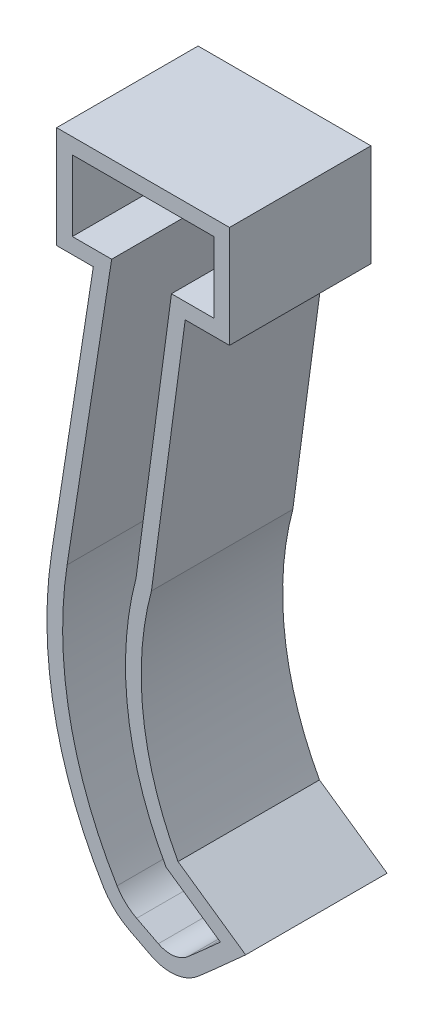
ISO-10303-21;
HEADER;
FILE_DESCRIPTION(('STEP AP214'),'2;1');
FILE_NAME('part.step','',(''),(''),'','','');
FILE_SCHEMA(('AUTOMOTIVE_DESIGN { 1 0 10303 214 1 1 1 1 }'));
ENDSEC;
DATA;
#1=APPLICATION_CONTEXT('core data for automotive mechanical design processes');
#2=APPLICATION_PROTOCOL_DEFINITION('international standard','automotive_design',2000,#1);
#3=PRODUCT_CONTEXT('',#1,'mechanical');
#4=PRODUCT('Part','Part','',(#3));
#5=PRODUCT_RELATED_PRODUCT_CATEGORY('part','',(#4));
#6=PRODUCT_DEFINITION_FORMATION('','',#4);
#7=PRODUCT_DEFINITION_CONTEXT('part definition',#1,'design');
#8=PRODUCT_DEFINITION('design','',#6,#7);
#9=PRODUCT_DEFINITION_SHAPE('','',#8);
#10=(LENGTH_UNIT() NAMED_UNIT(*) SI_UNIT(.MILLI.,.METRE.));
#11=(NAMED_UNIT(*) PLANE_ANGLE_UNIT() SI_UNIT($,.RADIAN.));
#12=(NAMED_UNIT(*) SI_UNIT($,.STERADIAN.) SOLID_ANGLE_UNIT());
#13=UNCERTAINTY_MEASURE_WITH_UNIT(LENGTH_MEASURE(1.E-05),#10,'distance_accuracy_value','');
#14=(GEOMETRIC_REPRESENTATION_CONTEXT(3) GLOBAL_UNCERTAINTY_ASSIGNED_CONTEXT((#13)) GLOBAL_UNIT_ASSIGNED_CONTEXT((#10,
#11,#12)) REPRESENTATION_CONTEXT('',''));
#15=CARTESIAN_POINT('',(0.,0.,0.));
#16=DIRECTION('',(0.,0.,1.));
#17=DIRECTION('',(1.,0.,0.));
#18=AXIS2_PLACEMENT_3D('',#15,#16,#17);
#19=CARTESIAN_POINT('',(0.,0.,16.));
#20=DIRECTION('',(0.,0.,1.));
#21=DIRECTION('',(1.,0.,0.));
#22=AXIS2_PLACEMENT_3D('',#19,#20,#21);
#23=PLANE('',#22);
#24=DIRECTION('',(0.,-1.,0.));
#25=VECTOR('',#24,1.);
#26=CARTESIAN_POINT('',(-48.7629088317488,41.8874487226326,16.));
#27=LINE('',#26,#25);
#28=CARTESIAN_POINT('',(-48.7629088317488,54.8874487226326,16.));
#29=VERTEX_POINT('',#28);
#30=CARTESIAN_POINT('',(-48.7629088317488,41.8874487226326,16.));
#31=VERTEX_POINT('',#30);
#32=EDGE_CURVE('E399',#29,#31,#27,.T.);
#33=ORIENTED_EDGE('',*,*,#32,.T.);
#34=DIRECTION('',(1.,0.,0.));
#35=VECTOR('',#34,1.);
#36=CARTESIAN_POINT('',(-44.0972783306751,41.8874487226326,16.));
#37=LINE('',#36,#35);
#38=CARTESIAN_POINT('',(-44.0972783306751,41.8874487226326,16.));
#39=VERTEX_POINT('',#38);
#40=EDGE_CURVE('E401',#31,#39,#37,.T.);
#41=ORIENTED_EDGE('',*,*,#40,.T.);
#42=DIRECTION('',(-0.153374734440995,-0.988168098470677,0.));
#43=VECTOR('',#42,1.);
#44=CARTESIAN_POINT('',(-49.4084049235339,7.66873672204978,16.));
#45=LINE('',#44,#43);
#46=CARTESIAN_POINT('',(-49.4084049235339,7.66873672204978,16.));
#47=VERTEX_POINT('',#46);
#48=EDGE_CURVE('E403',#39,#47,#45,.T.);
#49=ORIENTED_EDGE('',*,*,#48,.T.);
#50=CARTESIAN_POINT('',(0.,0.,16.));
#51=DIRECTION('',(0.,0.,1.));
#52=DIRECTION('',(1.,0.,0.));
#53=AXIS2_PLACEMENT_3D('',#50,#51,#52);
#54=CIRCLE('',#53,50.);
#55=CARTESIAN_POINT('',(-42.789032240421,-25.8669426088244,16.));
#56=VERTEX_POINT('',#55);
#57=EDGE_CURVE('E405',#47,#56,#54,.T.);
#58=ORIENTED_EDGE('',*,*,#57,.T.);
#59=CARTESIAN_POINT('',(-35.7012837669037,-21.5822375479546,16.));
#60=DIRECTION('',(0.,0.,1.));
#61=DIRECTION('',(1.,0.,0.));
#62=AXIS2_PLACEMENT_3D('',#59,#60,#61);
#63=CIRCLE('',#62,8.28220235701161);
#64=CARTESIAN_POINT('',(-39.4968156383013,-28.9435427104713,16.));
#65=VERTEX_POINT('',#64);
#66=EDGE_CURVE('E407',#56,#65,#63,.T.);
#67=ORIENTED_EDGE('',*,*,#66,.T.);
#68=DIRECTION('',(0.888810106925808,-0.458275674487021,0.));
#69=VECTOR('',#68,1.);
#70=CARTESIAN_POINT('',(-39.4968156383013,-28.9435427104713,16.));
#71=LINE('',#70,#69);
#72=CARTESIAN_POINT('',(-36.736058642487,-30.3670051176749,16.));
#73=VERTEX_POINT('',#72);
#74=EDGE_CURVE('E409',#65,#73,#71,.T.);
#75=ORIENTED_EDGE('',*,*,#74,.T.);
#76=CARTESIAN_POINT('',(-34.2757834827216,-25.5953850000115,16.));
#77=DIRECTION('',(0.,0.,1.));
#78=DIRECTION('',(1.,0.,0.));
#79=AXIS2_PLACEMENT_3D('',#76,#77,#78);
#80=CIRCLE('',#79,5.36854844525492);
#81=CARTESIAN_POINT('',(-30.7348627046786,-29.6306287909952,16.));
#82=VERTEX_POINT('',#81);
#83=EDGE_CURVE('E411',#73,#82,#80,.T.);
#84=ORIENTED_EDGE('',*,*,#83,.T.);
#85=DIRECTION('',(0.751645222564825,0.659567630645619,0.));
#86=VECTOR('',#85,1.);
#87=CARTESIAN_POINT('',(-28.7384354982377,-27.8787667119476,16.));
#88=LINE('',#87,#86);
#89=CARTESIAN_POINT('',(-28.7384354982377,-27.8787667119476,16.));
#90=VERTEX_POINT('',#89);
#91=EDGE_CURVE('E413',#82,#90,#88,.T.);
#92=ORIENTED_EDGE('',*,*,#91,.T.);
#93=DIRECTION('',(0.744371336366947,0.667765912274118,0.));
#94=VECTOR('',#93,1.);
#95=CARTESIAN_POINT('',(-28.7384354982377,-27.8787667119476,16.));
#96=LINE('',#95,#94);
#97=CARTESIAN_POINT('',(-24.7087669028506,-24.2638030583303,16.));
#98=VERTEX_POINT('',#97);
#99=EDGE_CURVE('E415',#90,#98,#96,.T.);
#100=ORIENTED_EDGE('',*,*,#99,.T.);
#101=DIRECTION('',(-0.821144887277735,0.570719785969995,0.));
#102=VECTOR('',#101,1.);
#103=CARTESIAN_POINT('',(-24.7087669028506,-24.2638030583303,16.));
#104=LINE('',#103,#102);
#105=CARTESIAN_POINT('',(-33.3118761230276,-18.2843897673416,16.));
#106=VERTEX_POINT('',#105);
#107=EDGE_CURVE('E417',#98,#106,#104,.T.);
#108=ORIENTED_EDGE('',*,*,#107,.T.);
#109=CARTESIAN_POINT('',(0.,0.,16.));
#110=DIRECTION('',(0.,0.,-1.));
#111=DIRECTION('',(1.,0.,0.));
#112=AXIS2_PLACEMENT_3D('',#109,#110,#111);
#113=CIRCLE('',#112,38.);
#114=CARTESIAN_POINT('',(-36.6998555679504,9.85497850284718,16.));
#115=VERTEX_POINT('',#114);
#116=EDGE_CURVE('E238',#106,#115,#113,.T.);
#117=ORIENTED_EDGE('',*,*,#116,.T.);
#118=DIRECTION('',(0.132966551067672,0.991120525615915,0.));
#119=VECTOR('',#118,1.);
#120=CARTESIAN_POINT('',(-32.402449776,41.8874487226326,16.));
#121=LINE('',#120,#119);
#122=CARTESIAN_POINT('',(-32.402449776,41.8874487226326,16.));
#123=VERTEX_POINT('',#122);
#124=EDGE_CURVE('E420',#115,#123,#121,.T.);
#125=ORIENTED_EDGE('',*,*,#124,.T.);
#126=DIRECTION('',(1.,0.,0.));
#127=VECTOR('',#126,1.);
#128=CARTESIAN_POINT('',(-26.7629088317488,41.8874487226326,16.));
#129=LINE('',#128,#127);
#130=CARTESIAN_POINT('',(-26.7629088317488,41.8874487226326,16.));
#131=VERTEX_POINT('',#130);
#132=EDGE_CURVE('E422',#123,#131,#129,.T.);
#133=ORIENTED_EDGE('',*,*,#132,.T.);
#134=DIRECTION('',(0.,1.,0.));
#135=VECTOR('',#134,1.);
#136=CARTESIAN_POINT('',(-26.7629088317488,54.8874487226326,16.));
#137=LINE('',#136,#135);
#138=CARTESIAN_POINT('',(-26.7629088317488,54.8874487226326,16.));
#139=VERTEX_POINT('',#138);
#140=EDGE_CURVE('E424',#131,#139,#137,.T.);
#141=ORIENTED_EDGE('',*,*,#140,.T.);
#142=DIRECTION('',(-1.,0.,0.));
#143=VECTOR('',#142,1.);
#144=CARTESIAN_POINT('',(-48.7629088317488,54.8874487226326,16.));
#145=LINE('',#144,#143);
#146=EDGE_CURVE('E57',#139,#29,#145,.T.);
#147=ORIENTED_EDGE('',*,*,#146,.T.);
#148=EDGE_LOOP('',(#33,#41,#49,#58,#67,#75,#84,#92,#100,#108,#117,#125,#133,#141,#147));
#149=FACE_BOUND('',#148,.T.);
#150=CARTESIAN_POINT('',(-35.7012837669037,-21.5822375479546,16.));
#151=DIRECTION('',(0.,0.,1.));
#152=DIRECTION('',(1.,0.,0.));
#153=AXIS2_PLACEMENT_3D('',#150,#151,#152);
#154=CIRCLE('',#153,6.28220235701162);
#155=CARTESIAN_POINT('',(-41.0774709508041,-24.8322649044715,16.));
#156=VERTEX_POINT('',#155);
#157=CARTESIAN_POINT('',(-38.5802642893273,-27.1659224966197,16.));
#158=VERTEX_POINT('',#157);
#159=EDGE_CURVE('E297',#156,#158,#154,.T.);
#160=ORIENTED_EDGE('',*,*,#159,.F.);
#161=CARTESIAN_POINT('',(0.,0.,16.));
#162=DIRECTION('',(0.,0.,1.));
#163=DIRECTION('',(1.,0.,0.));
#164=AXIS2_PLACEMENT_3D('',#161,#162,#163);
#165=CIRCLE('',#164,48.);
#166=CARTESIAN_POINT('',(-47.4320687265925,7.36198725316778,16.));
#167=VERTEX_POINT('',#166);
#168=EDGE_CURVE('E295',#167,#156,#165,.T.);
#169=ORIENTED_EDGE('',*,*,#168,.F.);
#170=DIRECTION('',(-0.153374734440995,-0.988168098470677,0.));
#171=VECTOR('',#170,1.);
#172=CARTESIAN_POINT('',(-47.4320687265925,7.36198725316778,16.));
#173=LINE('',#172,#171);
#174=CARTESIAN_POINT('',(-41.7629088317488,43.8874487226326,16.));
#175=VERTEX_POINT('',#174);
#176=EDGE_CURVE('E324',#175,#167,#173,.T.);
#177=ORIENTED_EDGE('',*,*,#176,.F.);
#178=DIRECTION('',(1.,0.,0.));
#179=VECTOR('',#178,1.);
#180=CARTESIAN_POINT('',(-41.7629088317488,43.8874487226326,16.));
#181=LINE('',#180,#179);
#182=CARTESIAN_POINT('',(-46.7629088317488,43.8874487226326,16.));
#183=VERTEX_POINT('',#182);
#184=EDGE_CURVE('E322',#183,#175,#181,.T.);
#185=ORIENTED_EDGE('',*,*,#184,.F.);
#186=DIRECTION('',(0.,-1.,0.));
#187=VECTOR('',#186,1.);
#188=CARTESIAN_POINT('',(-46.7629088317488,43.8874487226326,16.));
#189=LINE('',#188,#187);
#190=CARTESIAN_POINT('',(-46.7629088317488,52.8874487226326,16.));
#191=VERTEX_POINT('',#190);
#192=EDGE_CURVE('E320',#191,#183,#189,.T.);
#193=ORIENTED_EDGE('',*,*,#192,.F.);
#194=DIRECTION('',(-1.,0.,0.));
#195=VECTOR('',#194,1.);
#196=CARTESIAN_POINT('',(-46.7629088317488,52.8874487226326,16.));
#197=LINE('',#196,#195);
#198=CARTESIAN_POINT('',(-28.7629088317488,52.8874487226326,16.));
#199=VERTEX_POINT('',#198);
#200=EDGE_CURVE('E318',#199,#191,#197,.T.);
#201=ORIENTED_EDGE('',*,*,#200,.F.);
#202=DIRECTION('',(0.,1.,0.));
#203=VECTOR('',#202,1.);
#204=CARTESIAN_POINT('',(-28.7629088317488,52.8874487226326,16.));
#205=LINE('',#204,#203);
#206=CARTESIAN_POINT('',(-28.7629088317488,43.8874487226326,16.));
#207=VERTEX_POINT('',#206);
#208=EDGE_CURVE('E316',#207,#199,#205,.T.);
#209=ORIENTED_EDGE('',*,*,#208,.F.);
#210=DIRECTION('',(1.,0.,0.));
#211=VECTOR('',#210,1.);
#212=CARTESIAN_POINT('',(-28.7629088317488,43.8874487226326,16.));
#213=LINE('',#212,#211);
#214=CARTESIAN_POINT('',(-34.1520522239838,43.8874487226326,16.));
#215=VERTEX_POINT('',#214);
#216=EDGE_CURVE('E314',#215,#207,#213,.T.);
#217=ORIENTED_EDGE('',*,*,#216,.F.);
#218=DIRECTION('',(0.132966551067672,0.991120525615915,0.));
#219=VECTOR('',#218,1.);
#220=CARTESIAN_POINT('',(-34.1520522239838,43.8874487226326,16.));
#221=LINE('',#220,#219);
#222=CARTESIAN_POINT('',(-38.6651440398091,10.247274583069,16.));
#223=VERTEX_POINT('',#222);
#224=EDGE_CURVE('E312',#223,#215,#221,.T.);
#225=ORIENTED_EDGE('',*,*,#224,.F.);
#226=CARTESIAN_POINT('',(0.,0.,16.));
#227=DIRECTION('',(0.,0.,-1.));
#228=DIRECTION('',(1.,0.,0.));
#229=AXIS2_PLACEMENT_3D('',#226,#227,#228);
#230=CIRCLE('',#229,40.);
#231=CARTESIAN_POINT('',(-34.8338713027844,-19.6621822303898,16.));
#232=VERTEX_POINT('',#231);
#233=EDGE_CURVE('E310',#232,#223,#230,.T.);
#234=ORIENTED_EDGE('',*,*,#233,.F.);
#235=DIRECTION('',(-0.821144887277735,0.570719785969995,0.));
#236=VECTOR('',#235,1.);
#237=CARTESIAN_POINT('',(-27.9261539723172,-24.4632484215893,16.));
#238=LINE('',#237,#236);
#239=CARTESIAN_POINT('',(-27.9261539723172,-24.4632484215893,16.));
#240=VERTEX_POINT('',#239);
#241=EDGE_CURVE('E308',#240,#232,#238,.T.);
#242=ORIENTED_EDGE('',*,*,#241,.F.);
#243=DIRECTION('',(0.744371336366947,0.667765912274118,0.));
#244=VECTOR('',#243,1.);
#245=CARTESIAN_POINT('',(-30.065808902593,-26.3827052258248,16.));
#246=LINE('',#245,#244);
#247=CARTESIAN_POINT('',(-30.065808902593,-26.3827052258248,16.));
#248=VERTEX_POINT('',#247);
#249=EDGE_CURVE('E306',#248,#240,#246,.T.);
#250=ORIENTED_EDGE('',*,*,#249,.F.);
#251=DIRECTION('',(0.751645222564825,0.659567630645619,0.));
#252=VECTOR('',#251,1.);
#253=CARTESIAN_POINT('',(-30.065808902593,-26.3827052258248,16.));
#254=LINE('',#253,#252);
#255=CARTESIAN_POINT('',(-32.0539979659698,-28.1273383458655,16.));
#256=VERTEX_POINT('',#255);
#257=EDGE_CURVE('E304',#256,#248,#254,.T.);
#258=ORIENTED_EDGE('',*,*,#257,.F.);
#259=CARTESIAN_POINT('',(-34.2757834827216,-25.5953850000115,16.));
#260=DIRECTION('',(0.,0.,1.));
#261=DIRECTION('',(1.,0.,0.));
#262=AXIS2_PLACEMENT_3D('',#259,#260,#261);
#263=CIRCLE('',#262,3.36854844525494);
#264=CARTESIAN_POINT('',(-35.819507293513,-28.5893849038233,16.));
#265=VERTEX_POINT('',#264);
#266=EDGE_CURVE('E302',#265,#256,#263,.T.);
#267=ORIENTED_EDGE('',*,*,#266,.F.);
#268=DIRECTION('',(0.888810106925802,-0.458275674487033,0.));
#269=VECTOR('',#268,1.);
#270=CARTESIAN_POINT('',(-38.5802642893273,-27.1659224966197,16.));
#271=LINE('',#270,#269);
#272=EDGE_CURVE('E300',#158,#265,#271,.T.);
#273=ORIENTED_EDGE('',*,*,#272,.F.);
#274=EDGE_LOOP('',(#160,#169,#177,#185,#193,#201,#209,#217,#225,#234,#242,#250,#258,#267,#273));
#275=FACE_BOUND('',#274,.T.);
#276=ADVANCED_FACE('F34',(#149,#275),#23,.T.);
#277=CARTESIAN_POINT('',(-48.7629088317488,41.8874487226326,16.));
#278=DIRECTION('',(1.,0.,0.));
#279=DIRECTION('',(0.,0.,-1.));
#280=AXIS2_PLACEMENT_3D('',#277,#278,#279);
#281=PLANE('',#280);
#282=DIRECTION('',(0.,0.,-1.));
#283=VECTOR('',#282,1.);
#284=CARTESIAN_POINT('',(-48.7629088317488,54.8874487226326,16.));
#285=LINE('',#284,#283);
#286=CARTESIAN_POINT('',(-48.7629088317488,54.8874487226326,-2.));
#287=VERTEX_POINT('',#286);
#288=EDGE_CURVE('E427',#29,#287,#285,.T.);
#289=ORIENTED_EDGE('',*,*,#288,.T.);
#290=DIRECTION('',(0.,1.,0.));
#291=VECTOR('',#290,1.);
#292=CARTESIAN_POINT('',(-48.7629088317488,54.8874487226326,-2.));
#293=LINE('',#292,#291);
#294=CARTESIAN_POINT('',(-48.7629088317488,41.8874487226326,-2.));
#295=VERTEX_POINT('',#294);
#296=EDGE_CURVE('E282',#295,#287,#293,.T.);
#297=ORIENTED_EDGE('',*,*,#296,.F.);
#298=DIRECTION('',(0.,0.,-1.));
#299=VECTOR('',#298,1.);
#300=CARTESIAN_POINT('',(-48.7629088317488,41.8874487226326,16.));
#301=LINE('',#300,#299);
#302=EDGE_CURVE('E11',#31,#295,#301,.T.);
#303=ORIENTED_EDGE('',*,*,#302,.F.);
#304=ORIENTED_EDGE('',*,*,#32,.F.);
#305=EDGE_LOOP('',(#289,#297,#303,#304));
#306=FACE_BOUND('',#305,.T.);
#307=ADVANCED_FACE('F36',(#306),#281,.F.);
#308=CARTESIAN_POINT('',(-44.0972783306751,41.8874487226326,16.));
#309=DIRECTION('',(0.,1.,0.));
#310=DIRECTION('',(0.,0.,1.));
#311=AXIS2_PLACEMENT_3D('',#308,#309,#310);
#312=PLANE('',#311);
#313=ORIENTED_EDGE('',*,*,#302,.T.);
#314=DIRECTION('',(-1.,0.,0.));
#315=VECTOR('',#314,1.);
#316=CARTESIAN_POINT('',(-48.7629088317488,41.8874487226326,-2.));
#317=LINE('',#316,#315);
#318=CARTESIAN_POINT('',(-44.0972783306751,41.8874487226326,-2.));
#319=VERTEX_POINT('',#318);
#320=EDGE_CURVE('E279',#319,#295,#317,.T.);
#321=ORIENTED_EDGE('',*,*,#320,.F.);
#322=DIRECTION('',(0.,0.,-1.));
#323=VECTOR('',#322,1.);
#324=CARTESIAN_POINT('',(-44.0972783306751,41.8874487226326,16.));
#325=LINE('',#324,#323);
#326=EDGE_CURVE('E42',#39,#319,#325,.T.);
#327=ORIENTED_EDGE('',*,*,#326,.F.);
#328=ORIENTED_EDGE('',*,*,#40,.F.);
#329=EDGE_LOOP('',(#313,#321,#327,#328));
#330=FACE_BOUND('',#329,.T.);
#331=ADVANCED_FACE('F458',(#330),#312,.F.);
#332=CARTESIAN_POINT('',(-49.4084049235339,7.66873672204978,16.));
#333=DIRECTION('',(0.988168098470677,-0.153374734440995,0.));
#334=DIRECTION('',(0.153374734440995,0.988168098470677,0.));
#335=AXIS2_PLACEMENT_3D('',#332,#333,#334);
#336=PLANE('',#335);
#337=ORIENTED_EDGE('',*,*,#326,.T.);
#338=DIRECTION('',(0.153374734440995,0.988168098470677,0.));
#339=VECTOR('',#338,1.);
#340=CARTESIAN_POINT('',(-44.0972783306751,41.8874487226326,-2.));
#341=LINE('',#340,#339);
#342=CARTESIAN_POINT('',(-49.4084049235339,7.66873672204979,-2.));
#343=VERTEX_POINT('',#342);
#344=EDGE_CURVE('E276',#343,#319,#341,.T.);
#345=ORIENTED_EDGE('',*,*,#344,.F.);
#346=DIRECTION('',(0.,0.,-1.));
#347=VECTOR('',#346,1.);
#348=CARTESIAN_POINT('',(-49.4084049235339,7.66873672204978,16.));
#349=LINE('',#348,#347);
#350=EDGE_CURVE('E447',#47,#343,#349,.T.);
#351=ORIENTED_EDGE('',*,*,#350,.F.);
#352=ORIENTED_EDGE('',*,*,#48,.F.);
#353=EDGE_LOOP('',(#337,#345,#351,#352));
#354=FACE_BOUND('',#353,.T.);
#355=ADVANCED_FACE('F452',(#354),#336,.F.);
#356=CARTESIAN_POINT('',(0.,0.,16.));
#357=DIRECTION('',(0.,0.,-1.));
#358=DIRECTION('',(-1.,0.,0.));
#359=AXIS2_PLACEMENT_3D('',#356,#357,#358);
#360=CYLINDRICAL_SURFACE('',#359,50.);
#361=ORIENTED_EDGE('',*,*,#350,.T.);
#362=CARTESIAN_POINT('',(0.,0.,-2.));
#363=DIRECTION('',(0.,0.,-1.));
#364=DIRECTION('',(-1.,0.,0.));
#365=AXIS2_PLACEMENT_3D('',#362,#363,#364);
#366=CIRCLE('',#365,50.);
#367=CARTESIAN_POINT('',(-42.789032240421,-25.8669426088244,-2.));
#368=VERTEX_POINT('',#367);
#369=EDGE_CURVE('E273',#368,#343,#366,.T.);
#370=ORIENTED_EDGE('',*,*,#369,.F.);
#371=DIRECTION('',(0.,0.,-1.));
#372=VECTOR('',#371,1.);
#373=CARTESIAN_POINT('',(-42.789032240421,-25.8669426088244,16.));
#374=LINE('',#373,#372);
#375=EDGE_CURVE('E445',#56,#368,#374,.T.);
#376=ORIENTED_EDGE('',*,*,#375,.F.);
#377=ORIENTED_EDGE('',*,*,#57,.F.);
#378=EDGE_LOOP('',(#361,#370,#376,#377));
#379=FACE_BOUND('',#378,.T.);
#380=ADVANCED_FACE('F505',(#379),#360,.T.);
#381=CARTESIAN_POINT('',(-35.7012837669037,-21.5822375479546,16.));
#382=DIRECTION('',(0.,0.,-1.));
#383=DIRECTION('',(-1.,0.,0.));
#384=AXIS2_PLACEMENT_3D('',#381,#382,#383);
#385=CYLINDRICAL_SURFACE('',#384,8.28220235701161);
#386=ORIENTED_EDGE('',*,*,#375,.T.);
#387=CARTESIAN_POINT('',(-35.7012837669037,-21.5822375479546,-2.));
#388=DIRECTION('',(0.,0.,-1.));
#389=DIRECTION('',(-1.,0.,0.));
#390=AXIS2_PLACEMENT_3D('',#387,#388,#389);
#391=CIRCLE('',#390,8.28220235701161);
#392=CARTESIAN_POINT('',(-39.4968156383013,-28.9435427104713,-2.));
#393=VERTEX_POINT('',#392);
#394=EDGE_CURVE('E270',#393,#368,#391,.T.);
#395=ORIENTED_EDGE('',*,*,#394,.F.);
#396=DIRECTION('',(0.,0.,-1.));
#397=VECTOR('',#396,1.);
#398=CARTESIAN_POINT('',(-39.4968156383013,-28.9435427104713,16.));
#399=LINE('',#398,#397);
#400=EDGE_CURVE('E443',#65,#393,#399,.T.);
#401=ORIENTED_EDGE('',*,*,#400,.F.);
#402=ORIENTED_EDGE('',*,*,#66,.F.);
#403=EDGE_LOOP('',(#386,#395,#401,#402));
#404=FACE_BOUND('',#403,.T.);
#405=ADVANCED_FACE('F502',(#404),#385,.T.);
#406=CARTESIAN_POINT('',(-39.4968156383013,-28.9435427104713,16.));
#407=DIRECTION('',(0.458275674487021,0.888810106925808,0.));
#408=DIRECTION('',(-0.888810106925808,0.458275674487021,0.));
#409=AXIS2_PLACEMENT_3D('',#406,#407,#408);
#410=PLANE('',#409);
#411=ORIENTED_EDGE('',*,*,#400,.T.);
#412=DIRECTION('',(-0.888810106925811,0.458275674487015,0.));
#413=VECTOR('',#412,1.);
#414=CARTESIAN_POINT('',(-39.4968156383013,-28.9435427104713,-2.));
#415=LINE('',#414,#413);
#416=CARTESIAN_POINT('',(-36.736058642487,-30.3670051176749,-2.));
#417=VERTEX_POINT('',#416);
#418=EDGE_CURVE('E267',#417,#393,#415,.T.);
#419=ORIENTED_EDGE('',*,*,#418,.F.);
#420=DIRECTION('',(0.,0.,-1.));
#421=VECTOR('',#420,1.);
#422=CARTESIAN_POINT('',(-36.736058642487,-30.3670051176749,16.));
#423=LINE('',#422,#421);
#424=EDGE_CURVE('E441',#73,#417,#423,.T.);
#425=ORIENTED_EDGE('',*,*,#424,.F.);
#426=ORIENTED_EDGE('',*,*,#74,.F.);
#427=EDGE_LOOP('',(#411,#419,#425,#426));
#428=FACE_BOUND('',#427,.T.);
#429=ADVANCED_FACE('F497',(#428),#410,.F.);
#430=CARTESIAN_POINT('',(-34.2757834827216,-25.5953850000115,16.));
#431=DIRECTION('',(0.,0.,-1.));
#432=DIRECTION('',(-1.,0.,0.));
#433=AXIS2_PLACEMENT_3D('',#430,#431,#432);
#434=CYLINDRICAL_SURFACE('',#433,5.36854844525492);
#435=ORIENTED_EDGE('',*,*,#424,.T.);
#436=CARTESIAN_POINT('',(-34.2757834827216,-25.5953850000115,-2.));
#437=DIRECTION('',(0.,0.,-1.));
#438=DIRECTION('',(-1.,0.,0.));
#439=AXIS2_PLACEMENT_3D('',#436,#437,#438);
#440=CIRCLE('',#439,5.36854844525491);
#441=CARTESIAN_POINT('',(-30.7348627046786,-29.6306287909952,-2.));
#442=VERTEX_POINT('',#441);
#443=EDGE_CURVE('E264',#442,#417,#440,.T.);
#444=ORIENTED_EDGE('',*,*,#443,.F.);
#445=DIRECTION('',(0.,0.,-1.));
#446=VECTOR('',#445,1.);
#447=CARTESIAN_POINT('',(-30.7348627046786,-29.6306287909952,16.));
#448=LINE('',#447,#446);
#449=EDGE_CURVE('E439',#82,#442,#448,.T.);
#450=ORIENTED_EDGE('',*,*,#449,.F.);
#451=ORIENTED_EDGE('',*,*,#83,.F.);
#452=EDGE_LOOP('',(#435,#444,#450,#451));
#453=FACE_BOUND('',#452,.T.);
#454=ADVANCED_FACE('F492',(#453),#434,.T.);
#455=CARTESIAN_POINT('',(-28.7384354982377,-27.8787667119476,16.));
#456=DIRECTION('',(-0.659567630645619,0.751645222564825,0.));
#457=DIRECTION('',(-0.751645222564825,-0.659567630645619,0.));
#458=AXIS2_PLACEMENT_3D('',#455,#456,#457);
#459=PLANE('',#458);
#460=ORIENTED_EDGE('',*,*,#449,.T.);
#461=DIRECTION('',(-0.751645222564825,-0.659567630645619,0.));
#462=VECTOR('',#461,1.);
#463=CARTESIAN_POINT('',(-30.7348627046786,-29.6306287909952,-2.));
#464=LINE('',#463,#462);
#465=CARTESIAN_POINT('',(-28.7384354982377,-27.8787667119476,-2.));
#466=VERTEX_POINT('',#465);
#467=EDGE_CURVE('E261',#466,#442,#464,.T.);
#468=ORIENTED_EDGE('',*,*,#467,.F.);
#469=DIRECTION('',(0.,0.,-1.));
#470=VECTOR('',#469,1.);
#471=CARTESIAN_POINT('',(-28.7384354982377,-27.8787667119476,16.));
#472=LINE('',#471,#470);
#473=EDGE_CURVE('E437',#90,#466,#472,.T.);
#474=ORIENTED_EDGE('',*,*,#473,.F.);
#475=ORIENTED_EDGE('',*,*,#91,.F.);
#476=EDGE_LOOP('',(#460,#468,#474,#475));
#477=FACE_BOUND('',#476,.T.);
#478=ADVANCED_FACE('F488',(#477),#459,.F.);
#479=CARTESIAN_POINT('',(-28.7384354982377,-27.8787667119476,16.));
#480=DIRECTION('',(-0.667765912274119,0.744371336366947,0.));
#481=DIRECTION('',(-0.744371336366947,-0.667765912274119,0.));
#482=AXIS2_PLACEMENT_3D('',#479,#480,#481);
#483=PLANE('',#482);
#484=ORIENTED_EDGE('',*,*,#473,.T.);
#485=DIRECTION('',(-0.744371336366947,-0.667765912274118,0.));
#486=VECTOR('',#485,1.);
#487=CARTESIAN_POINT('',(-28.7384354982377,-27.8787667119476,-2.));
#488=LINE('',#487,#486);
#489=CARTESIAN_POINT('',(-24.7087669028506,-24.2638030583303,-2.));
#490=VERTEX_POINT('',#489);
#491=EDGE_CURVE('E251',#490,#466,#488,.T.);
#492=ORIENTED_EDGE('',*,*,#491,.F.);
#493=DIRECTION('',(0.,0.,-1.));
#494=VECTOR('',#493,1.);
#495=CARTESIAN_POINT('',(-24.7087669028506,-24.2638030583303,16.));
#496=LINE('',#495,#494);
#497=EDGE_CURVE('E241',#98,#490,#496,.T.);
#498=ORIENTED_EDGE('',*,*,#497,.F.);
#499=ORIENTED_EDGE('',*,*,#99,.F.);
#500=EDGE_LOOP('',(#484,#492,#498,#499));
#501=FACE_BOUND('',#500,.T.);
#502=ADVANCED_FACE('F484',(#501),#483,.F.);
#503=CARTESIAN_POINT('',(-24.7087669028506,-24.2638030583303,16.));
#504=DIRECTION('',(-0.570719785969995,-0.821144887277735,0.));
#505=DIRECTION('',(0.821144887277735,-0.570719785969995,0.));
#506=AXIS2_PLACEMENT_3D('',#503,#504,#505);
#507=PLANE('',#506);
#508=ORIENTED_EDGE('',*,*,#497,.T.);
#509=DIRECTION('',(0.821144887277735,-0.570719785969995,0.));
#510=VECTOR('',#509,1.);
#511=CARTESIAN_POINT('',(-24.7087669028506,-24.2638030583303,-2.));
#512=LINE('',#511,#510);
#513=CARTESIAN_POINT('',(-33.3118761230276,-18.2843897673416,-2.));
#514=VERTEX_POINT('',#513);
#515=EDGE_CURVE('E245',#514,#490,#512,.T.);
#516=ORIENTED_EDGE('',*,*,#515,.F.);
#517=DIRECTION('',(0.,0.,-1.));
#518=VECTOR('',#517,1.);
#519=CARTESIAN_POINT('',(-33.3118761230276,-18.2843897673416,16.));
#520=LINE('',#519,#518);
#521=EDGE_CURVE('E232',#106,#514,#520,.T.);
#522=ORIENTED_EDGE('',*,*,#521,.F.);
#523=ORIENTED_EDGE('',*,*,#107,.F.);
#524=EDGE_LOOP('',(#508,#516,#522,#523));
#525=FACE_BOUND('',#524,.T.);
#526=ADVANCED_FACE('F246',(#525),#507,.F.);
#527=CARTESIAN_POINT('',(0.,0.,16.));
#528=DIRECTION('',(0.,0.,-1.));
#529=DIRECTION('',(-1.,0.,0.));
#530=AXIS2_PLACEMENT_3D('',#527,#528,#529);
#531=CYLINDRICAL_SURFACE('',#530,38.);
#532=ORIENTED_EDGE('',*,*,#521,.T.);
#533=CARTESIAN_POINT('',(0.,0.,-2.));
#534=DIRECTION('',(0.,0.,1.));
#535=DIRECTION('',(-1.,0.,0.));
#536=AXIS2_PLACEMENT_3D('',#533,#534,#535);
#537=CIRCLE('',#536,38.);
#538=CARTESIAN_POINT('',(-36.6998555679504,9.85497850284718,-2.));
#539=VERTEX_POINT('',#538);
#540=EDGE_CURVE('E237',#539,#514,#537,.T.);
#541=ORIENTED_EDGE('',*,*,#540,.F.);
#542=DIRECTION('',(0.,0.,-1.));
#543=VECTOR('',#542,1.);
#544=CARTESIAN_POINT('',(-36.6998555679504,9.85497850284718,16.));
#545=LINE('',#544,#543);
#546=EDGE_CURVE('E242',#115,#539,#545,.T.);
#547=ORIENTED_EDGE('',*,*,#546,.F.);
#548=ORIENTED_EDGE('',*,*,#116,.F.);
#549=EDGE_LOOP('',(#532,#541,#547,#548));
#550=FACE_BOUND('',#549,.T.);
#551=ADVANCED_FACE('F234',(#550),#531,.F.);
#552=CARTESIAN_POINT('',(-32.402449776,41.8874487226326,16.));
#553=DIRECTION('',(-0.991120525615915,0.132966551067672,0.));
#554=DIRECTION('',(-0.132966551067672,-0.991120525615915,0.));
#555=AXIS2_PLACEMENT_3D('',#552,#553,#554);
#556=PLANE('',#555);
#557=ORIENTED_EDGE('',*,*,#546,.T.);
#558=DIRECTION('',(-0.132966551067672,-0.991120525615915,0.));
#559=VECTOR('',#558,1.);
#560=CARTESIAN_POINT('',(-36.6998555679504,9.85497850284718,-2.));
#561=LINE('',#560,#559);
#562=CARTESIAN_POINT('',(-32.402449776,41.8874487226326,-2.));
#563=VERTEX_POINT('',#562);
#564=EDGE_CURVE('E257',#563,#539,#561,.T.);
#565=ORIENTED_EDGE('',*,*,#564,.F.);
#566=DIRECTION('',(0.,0.,-1.));
#567=VECTOR('',#566,1.);
#568=CARTESIAN_POINT('',(-32.402449776,41.8874487226326,16.));
#569=LINE('',#568,#567);
#570=EDGE_CURVE('E433',#123,#563,#569,.T.);
#571=ORIENTED_EDGE('',*,*,#570,.F.);
#572=ORIENTED_EDGE('',*,*,#124,.F.);
#573=EDGE_LOOP('',(#557,#565,#571,#572));
#574=FACE_BOUND('',#573,.T.);
#575=ADVANCED_FACE('F478',(#574),#556,.F.);
#576=CARTESIAN_POINT('',(-26.7629088317488,41.8874487226326,16.));
#577=DIRECTION('',(0.,1.,0.));
#578=DIRECTION('',(0.,0.,1.));
#579=AXIS2_PLACEMENT_3D('',#576,#577,#578);
#580=PLANE('',#579);
#581=ORIENTED_EDGE('',*,*,#570,.T.);
#582=DIRECTION('',(-1.,0.,0.));
#583=VECTOR('',#582,1.);
#584=CARTESIAN_POINT('',(-32.402449776,41.8874487226326,-2.));
#585=LINE('',#584,#583);
#586=CARTESIAN_POINT('',(-26.7629088317488,41.8874487226326,-2.));
#587=VERTEX_POINT('',#586);
#588=EDGE_CURVE('E291',#587,#563,#585,.T.);
#589=ORIENTED_EDGE('',*,*,#588,.F.);
#590=DIRECTION('',(0.,0.,-1.));
#591=VECTOR('',#590,1.);
#592=CARTESIAN_POINT('',(-26.7629088317488,41.8874487226326,16.));
#593=LINE('',#592,#591);
#594=EDGE_CURVE('E431',#131,#587,#593,.T.);
#595=ORIENTED_EDGE('',*,*,#594,.F.);
#596=ORIENTED_EDGE('',*,*,#132,.F.);
#597=EDGE_LOOP('',(#581,#589,#595,#596));
#598=FACE_BOUND('',#597,.T.);
#599=ADVANCED_FACE('F473',(#598),#580,.F.);
#600=CARTESIAN_POINT('',(-26.7629088317488,54.8874487226326,16.));
#601=DIRECTION('',(-1.,0.,0.));
#602=DIRECTION('',(0.,0.,1.));
#603=AXIS2_PLACEMENT_3D('',#600,#601,#602);
#604=PLANE('',#603);
#605=ORIENTED_EDGE('',*,*,#594,.T.);
#606=DIRECTION('',(0.,-1.,0.));
#607=VECTOR('',#606,1.);
#608=CARTESIAN_POINT('',(-26.7629088317488,41.8874487226326,-2.));
#609=LINE('',#608,#607);
#610=CARTESIAN_POINT('',(-26.7629088317488,54.8874487226326,-2.));
#611=VERTEX_POINT('',#610);
#612=EDGE_CURVE('E288',#611,#587,#609,.T.);
#613=ORIENTED_EDGE('',*,*,#612,.F.);
#614=DIRECTION('',(0.,0.,-1.));
#615=VECTOR('',#614,1.);
#616=CARTESIAN_POINT('',(-26.7629088317488,54.8874487226326,16.));
#617=LINE('',#616,#615);
#618=EDGE_CURVE('E429',#139,#611,#617,.T.);
#619=ORIENTED_EDGE('',*,*,#618,.F.);
#620=ORIENTED_EDGE('',*,*,#140,.F.);
#621=EDGE_LOOP('',(#605,#613,#619,#620));
#622=FACE_BOUND('',#621,.T.);
#623=ADVANCED_FACE('F469',(#622),#604,.F.);
#624=CARTESIAN_POINT('',(-48.7629088317488,54.8874487226326,16.));
#625=DIRECTION('',(0.,-1.,0.));
#626=DIRECTION('',(0.,0.,-1.));
#627=AXIS2_PLACEMENT_3D('',#624,#625,#626);
#628=PLANE('',#627);
#629=ORIENTED_EDGE('',*,*,#618,.T.);
#630=DIRECTION('',(1.,0.,0.));
#631=VECTOR('',#630,1.);
#632=CARTESIAN_POINT('',(-26.7629088317488,54.8874487226326,-2.));
#633=LINE('',#632,#631);
#634=EDGE_CURVE('E285',#287,#611,#633,.T.);
#635=ORIENTED_EDGE('',*,*,#634,.F.);
#636=ORIENTED_EDGE('',*,*,#288,.F.);
#637=ORIENTED_EDGE('',*,*,#146,.F.);
#638=EDGE_LOOP('',(#629,#635,#636,#637));
#639=FACE_BOUND('',#638,.T.);
#640=ADVANCED_FACE('F465',(#639),#628,.F.);
#641=CARTESIAN_POINT('',(0.,0.,16.));
#642=DIRECTION('',(0.,0.,-1.));
#643=DIRECTION('',(-1.,0.,0.));
#644=AXIS2_PLACEMENT_3D('',#641,#642,#643);
#645=CYLINDRICAL_SURFACE('',#644,48.);
#646=CARTESIAN_POINT('',(0.,0.,0.));
#647=DIRECTION('',(0.,0.,1.));
#648=DIRECTION('',(1.,0.,0.));
#649=AXIS2_PLACEMENT_3D('',#646,#647,#648);
#650=CIRCLE('',#649,48.);
#651=CARTESIAN_POINT('',(-47.4320687265925,7.36198725316778,0.));
#652=VERTEX_POINT('',#651);
#653=CARTESIAN_POINT('',(-41.0774709508041,-24.8322649044715,0.));
#654=VERTEX_POINT('',#653);
#655=EDGE_CURVE('E294',#652,#654,#650,.T.);
#656=ORIENTED_EDGE('',*,*,#655,.F.);
#657=DIRECTION('',(0.,0.,-1.));
#658=VECTOR('',#657,1.);
#659=CARTESIAN_POINT('',(-47.4320687265925,7.36198725316778,16.));
#660=LINE('',#659,#658);
#661=EDGE_CURVE('E326',#167,#652,#660,.T.);
#662=ORIENTED_EDGE('',*,*,#661,.F.);
#663=ORIENTED_EDGE('',*,*,#168,.T.);
#664=DIRECTION('',(0.,0.,-1.));
#665=VECTOR('',#664,1.);
#666=CARTESIAN_POINT('',(-41.0774709508041,-24.8322649044715,16.));
#667=LINE('',#666,#665);
#668=EDGE_CURVE('E396',#156,#654,#667,.T.);
#669=ORIENTED_EDGE('',*,*,#668,.T.);
#670=EDGE_LOOP('',(#656,#662,#663,#669));
#671=FACE_BOUND('',#670,.T.);
#672=ADVANCED_FACE('F522',(#671),#645,.F.);
#673=CARTESIAN_POINT('',(-35.7012837669037,-21.5822375479546,16.));
#674=DIRECTION('',(0.,0.,-1.));
#675=DIRECTION('',(-1.,0.,0.));
#676=AXIS2_PLACEMENT_3D('',#673,#674,#675);
#677=CYLINDRICAL_SURFACE('',#676,6.28220235701162);
#678=CARTESIAN_POINT('',(-35.7012837669037,-21.5822375479546,0.));
#679=DIRECTION('',(0.,0.,1.));
#680=DIRECTION('',(1.,0.,0.));
#681=AXIS2_PLACEMENT_3D('',#678,#679,#680);
#682=CIRCLE('',#681,6.28220235701162);
#683=CARTESIAN_POINT('',(-38.5802642893273,-27.1659224966197,0.));
#684=VERTEX_POINT('',#683);
#685=EDGE_CURVE('E329',#654,#684,#682,.T.);
#686=ORIENTED_EDGE('',*,*,#685,.F.);
#687=ORIENTED_EDGE('',*,*,#668,.F.);
#688=ORIENTED_EDGE('',*,*,#159,.T.);
#689=DIRECTION('',(0.,0.,-1.));
#690=VECTOR('',#689,1.);
#691=CARTESIAN_POINT('',(-38.5802642893273,-27.1659224966197,16.));
#692=LINE('',#691,#690);
#693=EDGE_CURVE('E394',#158,#684,#692,.T.);
#694=ORIENTED_EDGE('',*,*,#693,.T.);
#695=EDGE_LOOP('',(#686,#687,#688,#694));
#696=FACE_BOUND('',#695,.T.);
#697=ADVANCED_FACE('F589',(#696),#677,.F.);
#698=CARTESIAN_POINT('',(-38.5802642893273,-27.1659224966197,16.));
#699=DIRECTION('',(0.458275674487033,0.888810106925802,0.));
#700=DIRECTION('',(-0.888810106925802,0.458275674487033,0.));
#701=AXIS2_PLACEMENT_3D('',#698,#699,#700);
#702=PLANE('',#701);
#703=DIRECTION('',(0.888810106925802,-0.458275674487033,0.));
#704=VECTOR('',#703,1.);
#705=CARTESIAN_POINT('',(-38.5802642893273,-27.1659224966197,0.));
#706=LINE('',#705,#704);
#707=CARTESIAN_POINT('',(-35.819507293513,-28.5893849038233,0.));
#708=VERTEX_POINT('',#707);
#709=EDGE_CURVE('E332',#684,#708,#706,.T.);
#710=ORIENTED_EDGE('',*,*,#709,.F.);
#711=ORIENTED_EDGE('',*,*,#693,.F.);
#712=ORIENTED_EDGE('',*,*,#272,.T.);
#713=DIRECTION('',(0.,0.,-1.));
#714=VECTOR('',#713,1.);
#715=CARTESIAN_POINT('',(-35.819507293513,-28.5893849038233,16.));
#716=LINE('',#715,#714);
#717=EDGE_CURVE('E392',#265,#708,#716,.T.);
#718=ORIENTED_EDGE('',*,*,#717,.T.);
#719=EDGE_LOOP('',(#710,#711,#712,#718));
#720=FACE_BOUND('',#719,.T.);
#721=ADVANCED_FACE('F596',(#720),#702,.T.);
#722=CARTESIAN_POINT('',(-34.2757834827216,-25.5953850000115,16.));
#723=DIRECTION('',(0.,0.,-1.));
#724=DIRECTION('',(-1.,0.,0.));
#725=AXIS2_PLACEMENT_3D('',#722,#723,#724);
#726=CYLINDRICAL_SURFACE('',#725,3.36854844525494);
#727=CARTESIAN_POINT('',(-34.2757834827216,-25.5953850000115,0.));
#728=DIRECTION('',(0.,0.,1.));
#729=DIRECTION('',(1.,0.,0.));
#730=AXIS2_PLACEMENT_3D('',#727,#728,#729);
#731=CIRCLE('',#730,3.36854844525494);
#732=CARTESIAN_POINT('',(-32.0539979659698,-28.1273383458655,0.));
#733=VERTEX_POINT('',#732);
#734=EDGE_CURVE('E335',#708,#733,#731,.T.);
#735=ORIENTED_EDGE('',*,*,#734,.F.);
#736=ORIENTED_EDGE('',*,*,#717,.F.);
#737=ORIENTED_EDGE('',*,*,#266,.T.);
#738=DIRECTION('',(0.,0.,-1.));
#739=VECTOR('',#738,1.);
#740=CARTESIAN_POINT('',(-32.0539979659698,-28.1273383458655,16.));
#741=LINE('',#740,#739);
#742=EDGE_CURVE('E390',#256,#733,#741,.T.);
#743=ORIENTED_EDGE('',*,*,#742,.T.);
#744=EDGE_LOOP('',(#735,#736,#737,#743));
#745=FACE_BOUND('',#744,.T.);
#746=ADVANCED_FACE('F603',(#745),#726,.F.);
#747=CARTESIAN_POINT('',(-30.065808902593,-26.3827052258248,16.));
#748=DIRECTION('',(-0.659567630645619,0.751645222564825,0.));
#749=DIRECTION('',(-0.751645222564825,-0.659567630645619,0.));
#750=AXIS2_PLACEMENT_3D('',#747,#748,#749);
#751=PLANE('',#750);
#752=DIRECTION('',(0.751645222564825,0.659567630645619,0.));
#753=VECTOR('',#752,1.);
#754=CARTESIAN_POINT('',(-30.065808902593,-26.3827052258248,0.));
#755=LINE('',#754,#753);
#756=CARTESIAN_POINT('',(-30.065808902593,-26.3827052258248,0.));
#757=VERTEX_POINT('',#756);
#758=EDGE_CURVE('E338',#733,#757,#755,.T.);
#759=ORIENTED_EDGE('',*,*,#758,.F.);
#760=ORIENTED_EDGE('',*,*,#742,.F.);
#761=ORIENTED_EDGE('',*,*,#257,.T.);
#762=DIRECTION('',(0.,0.,-1.));
#763=VECTOR('',#762,1.);
#764=CARTESIAN_POINT('',(-30.065808902593,-26.3827052258248,16.));
#765=LINE('',#764,#763);
#766=EDGE_CURVE('E388',#248,#757,#765,.T.);
#767=ORIENTED_EDGE('',*,*,#766,.T.);
#768=EDGE_LOOP('',(#759,#760,#761,#767));
#769=FACE_BOUND('',#768,.T.);
#770=ADVANCED_FACE('F611',(#769),#751,.T.);
#771=CARTESIAN_POINT('',(-30.065808902593,-26.3827052258248,16.));
#772=DIRECTION('',(-0.667765912274118,0.744371336366947,0.));
#773=DIRECTION('',(-0.744371336366947,-0.667765912274118,0.));
#774=AXIS2_PLACEMENT_3D('',#771,#772,#773);
#775=PLANE('',#774);
#776=DIRECTION('',(0.744371336366947,0.667765912274118,0.));
#777=VECTOR('',#776,1.);
#778=CARTESIAN_POINT('',(-30.065808902593,-26.3827052258248,0.));
#779=LINE('',#778,#777);
#780=CARTESIAN_POINT('',(-27.9261539723172,-24.4632484215893,0.));
#781=VERTEX_POINT('',#780);
#782=EDGE_CURVE('E341',#757,#781,#779,.T.);
#783=ORIENTED_EDGE('',*,*,#782,.F.);
#784=ORIENTED_EDGE('',*,*,#766,.F.);
#785=ORIENTED_EDGE('',*,*,#249,.T.);
#786=DIRECTION('',(0.,0.,-1.));
#787=VECTOR('',#786,1.);
#788=CARTESIAN_POINT('',(-27.9261539723172,-24.4632484215893,16.));
#789=LINE('',#788,#787);
#790=EDGE_CURVE('E386',#240,#781,#789,.T.);
#791=ORIENTED_EDGE('',*,*,#790,.T.);
#792=EDGE_LOOP('',(#783,#784,#785,#791));
#793=FACE_BOUND('',#792,.T.);
#794=ADVANCED_FACE('F619',(#793),#775,.T.);
#795=CARTESIAN_POINT('',(-27.9261539723172,-24.4632484215893,16.));
#796=DIRECTION('',(-0.570719785969995,-0.821144887277735,0.));
#797=DIRECTION('',(0.821144887277735,-0.570719785969995,0.));
#798=AXIS2_PLACEMENT_3D('',#795,#796,#797);
#799=PLANE('',#798);
#800=DIRECTION('',(-0.821144887277735,0.570719785969995,0.));
#801=VECTOR('',#800,1.);
#802=CARTESIAN_POINT('',(-27.9261539723172,-24.4632484215893,0.));
#803=LINE('',#802,#801);
#804=CARTESIAN_POINT('',(-34.8338713027844,-19.6621822303898,0.));
#805=VERTEX_POINT('',#804);
#806=EDGE_CURVE('E344',#781,#805,#803,.T.);
#807=ORIENTED_EDGE('',*,*,#806,.F.);
#808=ORIENTED_EDGE('',*,*,#790,.F.);
#809=ORIENTED_EDGE('',*,*,#241,.T.);
#810=DIRECTION('',(0.,0.,-1.));
#811=VECTOR('',#810,1.);
#812=CARTESIAN_POINT('',(-34.8338713027844,-19.6621822303898,16.));
#813=LINE('',#812,#811);
#814=EDGE_CURVE('E384',#232,#805,#813,.T.);
#815=ORIENTED_EDGE('',*,*,#814,.T.);
#816=EDGE_LOOP('',(#807,#808,#809,#815));
#817=FACE_BOUND('',#816,.T.);
#818=ADVANCED_FACE('F627',(#817),#799,.T.);
#819=CARTESIAN_POINT('',(0.,0.,16.));
#820=DIRECTION('',(0.,0.,-1.));
#821=DIRECTION('',(-1.,0.,0.));
#822=AXIS2_PLACEMENT_3D('',#819,#820,#821);
#823=CYLINDRICAL_SURFACE('',#822,40.);
#824=CARTESIAN_POINT('',(0.,0.,0.));
#825=DIRECTION('',(0.,0.,-1.));
#826=DIRECTION('',(1.,0.,0.));
#827=AXIS2_PLACEMENT_3D('',#824,#825,#826);
#828=CIRCLE('',#827,40.);
#829=CARTESIAN_POINT('',(-38.6651440398091,10.247274583069,0.));
#830=VERTEX_POINT('',#829);
#831=EDGE_CURVE('E347',#805,#830,#828,.T.);
#832=ORIENTED_EDGE('',*,*,#831,.F.);
#833=ORIENTED_EDGE('',*,*,#814,.F.);
#834=ORIENTED_EDGE('',*,*,#233,.T.);
#835=DIRECTION('',(0.,0.,-1.));
#836=VECTOR('',#835,1.);
#837=CARTESIAN_POINT('',(-38.6651440398091,10.247274583069,16.));
#838=LINE('',#837,#836);
#839=EDGE_CURVE('E382',#223,#830,#838,.T.);
#840=ORIENTED_EDGE('',*,*,#839,.T.);
#841=EDGE_LOOP('',(#832,#833,#834,#840));
#842=FACE_BOUND('',#841,.T.);
#843=ADVANCED_FACE('F635',(#842),#823,.T.);
#844=CARTESIAN_POINT('',(-34.1520522239838,43.8874487226326,16.));
#845=DIRECTION('',(-0.991120525615915,0.132966551067672,0.));
#846=DIRECTION('',(-0.132966551067672,-0.991120525615915,0.));
#847=AXIS2_PLACEMENT_3D('',#844,#845,#846);
#848=PLANE('',#847);
#849=DIRECTION('',(0.132966551067672,0.991120525615915,0.));
#850=VECTOR('',#849,1.);
#851=CARTESIAN_POINT('',(-34.1520522239838,43.8874487226326,0.));
#852=LINE('',#851,#850);
#853=CARTESIAN_POINT('',(-34.1520522239838,43.8874487226326,0.));
#854=VERTEX_POINT('',#853);
#855=EDGE_CURVE('E350',#830,#854,#852,.T.);
#856=ORIENTED_EDGE('',*,*,#855,.F.);
#857=ORIENTED_EDGE('',*,*,#839,.F.);
#858=ORIENTED_EDGE('',*,*,#224,.T.);
#859=DIRECTION('',(0.,0.,-1.));
#860=VECTOR('',#859,1.);
#861=CARTESIAN_POINT('',(-34.1520522239838,43.8874487226326,16.));
#862=LINE('',#861,#860);
#863=EDGE_CURVE('E380',#215,#854,#862,.T.);
#864=ORIENTED_EDGE('',*,*,#863,.T.);
#865=EDGE_LOOP('',(#856,#857,#858,#864));
#866=FACE_BOUND('',#865,.T.);
#867=ADVANCED_FACE('F643',(#866),#848,.T.);
#868=CARTESIAN_POINT('',(-28.7629088317488,43.8874487226326,16.));
#869=DIRECTION('',(0.,1.,0.));
#870=DIRECTION('',(0.,0.,1.));
#871=AXIS2_PLACEMENT_3D('',#868,#869,#870);
#872=PLANE('',#871);
#873=DIRECTION('',(1.,0.,0.));
#874=VECTOR('',#873,1.);
#875=CARTESIAN_POINT('',(-28.7629088317488,43.8874487226326,0.));
#876=LINE('',#875,#874);
#877=CARTESIAN_POINT('',(-28.7629088317488,43.8874487226326,0.));
#878=VERTEX_POINT('',#877);
#879=EDGE_CURVE('E353',#854,#878,#876,.T.);
#880=ORIENTED_EDGE('',*,*,#879,.F.);
#881=ORIENTED_EDGE('',*,*,#863,.F.);
#882=ORIENTED_EDGE('',*,*,#216,.T.);
#883=DIRECTION('',(0.,0.,-1.));
#884=VECTOR('',#883,1.);
#885=CARTESIAN_POINT('',(-28.7629088317488,43.8874487226326,16.));
#886=LINE('',#885,#884);
#887=EDGE_CURVE('E378',#207,#878,#886,.T.);
#888=ORIENTED_EDGE('',*,*,#887,.T.);
#889=EDGE_LOOP('',(#880,#881,#882,#888));
#890=FACE_BOUND('',#889,.T.);
#891=ADVANCED_FACE('F651',(#890),#872,.T.);
#892=CARTESIAN_POINT('',(-28.7629088317488,52.8874487226326,16.));
#893=DIRECTION('',(-1.,0.,0.));
#894=DIRECTION('',(0.,0.,1.));
#895=AXIS2_PLACEMENT_3D('',#892,#893,#894);
#896=PLANE('',#895);
#897=DIRECTION('',(0.,1.,0.));
#898=VECTOR('',#897,1.);
#899=CARTESIAN_POINT('',(-28.7629088317488,52.8874487226326,0.));
#900=LINE('',#899,#898);
#901=CARTESIAN_POINT('',(-28.7629088317488,52.8874487226326,0.));
#902=VERTEX_POINT('',#901);
#903=EDGE_CURVE('E356',#878,#902,#900,.T.);
#904=ORIENTED_EDGE('',*,*,#903,.F.);
#905=ORIENTED_EDGE('',*,*,#887,.F.);
#906=ORIENTED_EDGE('',*,*,#208,.T.);
#907=DIRECTION('',(0.,0.,-1.));
#908=VECTOR('',#907,1.);
#909=CARTESIAN_POINT('',(-28.7629088317488,52.8874487226326,16.));
#910=LINE('',#909,#908);
#911=EDGE_CURVE('E376',#199,#902,#910,.T.);
#912=ORIENTED_EDGE('',*,*,#911,.T.);
#913=EDGE_LOOP('',(#904,#905,#906,#912));
#914=FACE_BOUND('',#913,.T.);
#915=ADVANCED_FACE('F659',(#914),#896,.T.);
#916=CARTESIAN_POINT('',(-46.7629088317488,52.8874487226326,16.));
#917=DIRECTION('',(0.,-1.,0.));
#918=DIRECTION('',(0.,0.,-1.));
#919=AXIS2_PLACEMENT_3D('',#916,#917,#918);
#920=PLANE('',#919);
#921=DIRECTION('',(-1.,0.,0.));
#922=VECTOR('',#921,1.);
#923=CARTESIAN_POINT('',(-46.7629088317488,52.8874487226326,0.));
#924=LINE('',#923,#922);
#925=CARTESIAN_POINT('',(-46.7629088317488,52.8874487226326,0.));
#926=VERTEX_POINT('',#925);
#927=EDGE_CURVE('E359',#902,#926,#924,.T.);
#928=ORIENTED_EDGE('',*,*,#927,.F.);
#929=ORIENTED_EDGE('',*,*,#911,.F.);
#930=ORIENTED_EDGE('',*,*,#200,.T.);
#931=DIRECTION('',(0.,0.,-1.));
#932=VECTOR('',#931,1.);
#933=CARTESIAN_POINT('',(-46.7629088317488,52.8874487226326,16.));
#934=LINE('',#933,#932);
#935=EDGE_CURVE('E374',#191,#926,#934,.T.);
#936=ORIENTED_EDGE('',*,*,#935,.T.);
#937=EDGE_LOOP('',(#928,#929,#930,#936));
#938=FACE_BOUND('',#937,.T.);
#939=ADVANCED_FACE('F667',(#938),#920,.T.);
#940=CARTESIAN_POINT('',(-46.7629088317488,43.8874487226326,16.));
#941=DIRECTION('',(1.,0.,0.));
#942=DIRECTION('',(0.,0.,-1.));
#943=AXIS2_PLACEMENT_3D('',#940,#941,#942);
#944=PLANE('',#943);
#945=DIRECTION('',(0.,-1.,0.));
#946=VECTOR('',#945,1.);
#947=CARTESIAN_POINT('',(-46.7629088317488,43.8874487226326,0.));
#948=LINE('',#947,#946);
#949=CARTESIAN_POINT('',(-46.7629088317488,43.8874487226326,0.));
#950=VERTEX_POINT('',#949);
#951=EDGE_CURVE('E362',#926,#950,#948,.T.);
#952=ORIENTED_EDGE('',*,*,#951,.F.);
#953=ORIENTED_EDGE('',*,*,#935,.F.);
#954=ORIENTED_EDGE('',*,*,#192,.T.);
#955=DIRECTION('',(0.,0.,-1.));
#956=VECTOR('',#955,1.);
#957=CARTESIAN_POINT('',(-46.7629088317488,43.8874487226326,16.));
#958=LINE('',#957,#956);
#959=EDGE_CURVE('E372',#183,#950,#958,.T.);
#960=ORIENTED_EDGE('',*,*,#959,.T.);
#961=EDGE_LOOP('',(#952,#953,#954,#960));
#962=FACE_BOUND('',#961,.T.);
#963=ADVANCED_FACE('F675',(#962),#944,.T.);
#964=CARTESIAN_POINT('',(-41.7629088317488,43.8874487226326,16.));
#965=DIRECTION('',(0.,1.,0.));
#966=DIRECTION('',(0.,0.,1.));
#967=AXIS2_PLACEMENT_3D('',#964,#965,#966);
#968=PLANE('',#967);
#969=DIRECTION('',(1.,0.,0.));
#970=VECTOR('',#969,1.);
#971=CARTESIAN_POINT('',(-41.7629088317488,43.8874487226326,0.));
#972=LINE('',#971,#970);
#973=CARTESIAN_POINT('',(-41.7629088317488,43.8874487226326,0.));
#974=VERTEX_POINT('',#973);
#975=EDGE_CURVE('E365',#950,#974,#972,.T.);
#976=ORIENTED_EDGE('',*,*,#975,.F.);
#977=ORIENTED_EDGE('',*,*,#959,.F.);
#978=ORIENTED_EDGE('',*,*,#184,.T.);
#979=DIRECTION('',(0.,0.,-1.));
#980=VECTOR('',#979,1.);
#981=CARTESIAN_POINT('',(-41.7629088317488,43.8874487226326,16.));
#982=LINE('',#981,#980);
#983=EDGE_CURVE('E49',#175,#974,#982,.T.);
#984=ORIENTED_EDGE('',*,*,#983,.T.);
#985=EDGE_LOOP('',(#976,#977,#978,#984));
#986=FACE_BOUND('',#985,.T.);
#987=ADVANCED_FACE('F683',(#986),#968,.T.);
#988=CARTESIAN_POINT('',(-47.4320687265925,7.36198725316778,16.));
#989=DIRECTION('',(0.988168098470677,-0.153374734440995,0.));
#990=DIRECTION('',(0.153374734440995,0.988168098470677,0.));
#991=AXIS2_PLACEMENT_3D('',#988,#989,#990);
#992=PLANE('',#991);
#993=DIRECTION('',(-0.153374734440995,-0.988168098470677,0.));
#994=VECTOR('',#993,1.);
#995=CARTESIAN_POINT('',(-47.4320687265925,7.36198725316778,0.));
#996=LINE('',#995,#994);
#997=EDGE_CURVE('E298',#974,#652,#996,.T.);
#998=ORIENTED_EDGE('',*,*,#997,.F.);
#999=ORIENTED_EDGE('',*,*,#983,.F.);
#1000=ORIENTED_EDGE('',*,*,#176,.T.);
#1001=ORIENTED_EDGE('',*,*,#661,.T.);
#1002=EDGE_LOOP('',(#998,#999,#1000,#1001));
#1003=FACE_BOUND('',#1002,.T.);
#1004=ADVANCED_FACE('F691',(#1003),#992,.T.);
#1005=CARTESIAN_POINT('',(0.,0.,0.));
#1006=DIRECTION('',(0.,0.,-1.));
#1007=DIRECTION('',(-1.,0.,0.));
#1008=AXIS2_PLACEMENT_3D('',#1005,#1006,#1007);
#1009=PLANE('',#1008);
#1010=ORIENTED_EDGE('',*,*,#997,.T.);
#1011=ORIENTED_EDGE('',*,*,#655,.T.);
#1012=ORIENTED_EDGE('',*,*,#685,.T.);
#1013=ORIENTED_EDGE('',*,*,#709,.T.);
#1014=ORIENTED_EDGE('',*,*,#734,.T.);
#1015=ORIENTED_EDGE('',*,*,#758,.T.);
#1016=ORIENTED_EDGE('',*,*,#782,.T.);
#1017=ORIENTED_EDGE('',*,*,#806,.T.);
#1018=ORIENTED_EDGE('',*,*,#831,.T.);
#1019=ORIENTED_EDGE('',*,*,#855,.T.);
#1020=ORIENTED_EDGE('',*,*,#879,.T.);
#1021=ORIENTED_EDGE('',*,*,#903,.T.);
#1022=ORIENTED_EDGE('',*,*,#927,.T.);
#1023=ORIENTED_EDGE('',*,*,#951,.T.);
#1024=ORIENTED_EDGE('',*,*,#975,.T.);
#1025=EDGE_LOOP('',(#1010,#1011,#1012,#1013,#1014,#1015,#1016,#1017,#1018,#1019,#1020,#1021,
#1022,#1023,#1024));
#1026=FACE_BOUND('',#1025,.T.);
#1027=ADVANCED_FACE('F699',(#1026),#1009,.F.);
#1028=CARTESIAN_POINT('',(0.,0.,-2.));
#1029=DIRECTION('',(0.,0.,-1.));
#1030=DIRECTION('',(-1.,0.,0.));
#1031=AXIS2_PLACEMENT_3D('',#1028,#1029,#1030);
#1032=PLANE('',#1031);
#1033=ORIENTED_EDGE('',*,*,#540,.T.);
#1034=ORIENTED_EDGE('',*,*,#515,.T.);
#1035=ORIENTED_EDGE('',*,*,#491,.T.);
#1036=ORIENTED_EDGE('',*,*,#467,.T.);
#1037=ORIENTED_EDGE('',*,*,#443,.T.);
#1038=ORIENTED_EDGE('',*,*,#418,.T.);
#1039=ORIENTED_EDGE('',*,*,#394,.T.);
#1040=ORIENTED_EDGE('',*,*,#369,.T.);
#1041=ORIENTED_EDGE('',*,*,#344,.T.);
#1042=ORIENTED_EDGE('',*,*,#320,.T.);
#1043=ORIENTED_EDGE('',*,*,#296,.T.);
#1044=ORIENTED_EDGE('',*,*,#634,.T.);
#1045=ORIENTED_EDGE('',*,*,#612,.T.);
#1046=ORIENTED_EDGE('',*,*,#588,.T.);
#1047=ORIENTED_EDGE('',*,*,#564,.T.);
#1048=EDGE_LOOP('',(#1033,#1034,#1035,#1036,#1037,#1038,#1039,#1040,#1041,#1042,#1043,#1044,
#1045,#1046,#1047));
#1049=FACE_BOUND('',#1048,.T.);
#1050=ADVANCED_FACE('F254',(#1049),#1032,.T.);
#1051=CLOSED_SHELL('',(#276,#307,#331,#355,#380,#405,#429,#454,#478,#502,#526,#551,#575,#599,
#623,#640,#672,#697,#721,#746,#770,#794,#818,#843,#867,#891,#915,#939,#963,#987,#1004,#1027,#1050));
#1052=MANIFOLD_SOLID_BREP('B2',#1051);
#1053=ADVANCED_BREP_SHAPE_REPRESENTATION('',(#18,#1052),#14);
#1054=SHAPE_DEFINITION_REPRESENTATION(#9,#1053);
ENDSEC;
END-ISO-10303-21;
